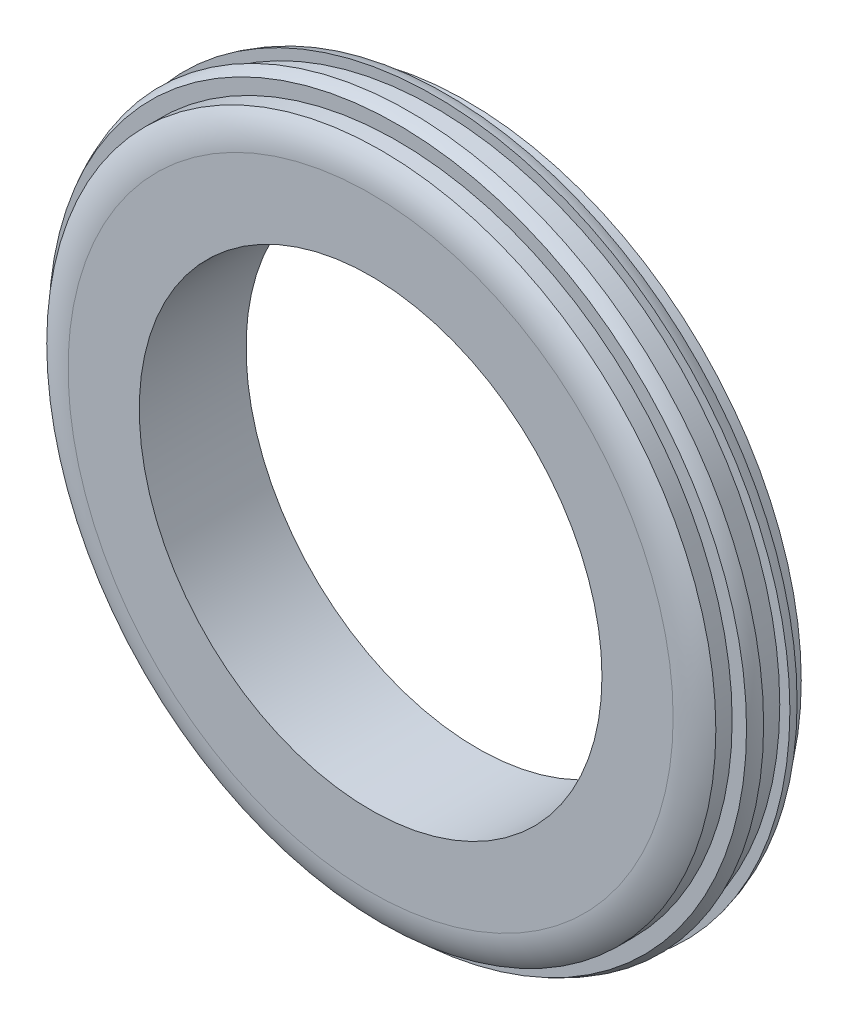
ISO-10303-21;
HEADER;
FILE_DESCRIPTION(('STEP AP214'),'2;1');
FILE_NAME('part.step','',(''),(''),'','','');
FILE_SCHEMA(('AUTOMOTIVE_DESIGN { 1 0 10303 214 1 1 1 1 }'));
ENDSEC;
DATA;
#1=APPLICATION_CONTEXT('core data for automotive mechanical design processes');
#2=APPLICATION_PROTOCOL_DEFINITION('international standard','automotive_design',2000,#1);
#3=PRODUCT_CONTEXT('',#1,'mechanical');
#4=PRODUCT('Part','Part','',(#3));
#5=PRODUCT_RELATED_PRODUCT_CATEGORY('part','',(#4));
#6=PRODUCT_DEFINITION_FORMATION('','',#4);
#7=PRODUCT_DEFINITION_CONTEXT('part definition',#1,'design');
#8=PRODUCT_DEFINITION('design','',#6,#7);
#9=PRODUCT_DEFINITION_SHAPE('','',#8);
#10=(LENGTH_UNIT() NAMED_UNIT(*) SI_UNIT(.MILLI.,.METRE.));
#11=(NAMED_UNIT(*) PLANE_ANGLE_UNIT() SI_UNIT($,.RADIAN.));
#12=(NAMED_UNIT(*) SI_UNIT($,.STERADIAN.) SOLID_ANGLE_UNIT());
#13=UNCERTAINTY_MEASURE_WITH_UNIT(LENGTH_MEASURE(1.E-05),#10,'distance_accuracy_value','');
#14=(GEOMETRIC_REPRESENTATION_CONTEXT(3) GLOBAL_UNCERTAINTY_ASSIGNED_CONTEXT((#13)) GLOBAL_UNIT_ASSIGNED_CONTEXT((#10,
#11,#12)) REPRESENTATION_CONTEXT('',''));
#15=CARTESIAN_POINT('',(0.,0.,0.));
#16=DIRECTION('',(0.,0.,1.));
#17=DIRECTION('',(1.,0.,0.));
#18=AXIS2_PLACEMENT_3D('',#15,#16,#17);
#19=CARTESIAN_POINT('',(0.,0.,3.90243902439026));
#20=DIRECTION('',(0.,0.,1.));
#21=DIRECTION('',(1.,0.,0.));
#22=AXIS2_PLACEMENT_3D('',#19,#20,#21);
#23=TOROIDAL_SURFACE('',#22,170.,30.);
#24=CARTESIAN_POINT('',(0.,0.,-26.0975609756097));
#25=DIRECTION('',(0.,0.,1.));
#26=DIRECTION('',(1.,0.,0.));
#27=AXIS2_PLACEMENT_3D('',#24,#25,#26);
#28=CIRCLE('',#27,170.);
#29=CARTESIAN_POINT('',(170.,0.,-26.0975609756097));
#30=VERTEX_POINT('',#29);
#31=EDGE_CURVE('E65',#30,#30,#28,.T.);
#32=ORIENTED_EDGE('',*,*,#31,.T.);
#33=EDGE_LOOP('',(#32));
#34=FACE_BOUND('',#33,.T.);
#35=CARTESIAN_POINT('',(0.,0.,-20.099283843259));
#36=DIRECTION('',(0.,0.,1.));
#37=DIRECTION('',(1.,0.,0.));
#38=AXIS2_PLACEMENT_3D('',#35,#36,#37);
#39=CIRCLE('',#38,187.997702614072);
#40=CARTESIAN_POINT('',(187.997702614072,0.,-20.099283843259));
#41=VERTEX_POINT('',#40);
#42=EDGE_CURVE('E60',#41,#41,#39,.T.);
#43=ORIENTED_EDGE('',*,*,#42,.F.);
#44=EDGE_LOOP('',(#43));
#45=FACE_BOUND('',#44,.T.);
#46=ADVANCED_FACE('F31',(#34,#45),#23,.T.);
#47=CARTESIAN_POINT('',(0.,0.,33.9024390243902));
#48=DIRECTION('',(0.,0.,1.));
#49=DIRECTION('',(1.,0.,0.));
#50=AXIS2_PLACEMENT_3D('',#47,#48,#49);
#51=CIRCLE('',#50,170.);
#52=CARTESIAN_POINT('',(170.,0.,33.9024390243902));
#53=VERTEX_POINT('',#52);
#54=EDGE_CURVE('E44',#53,#53,#51,.T.);
#55=ORIENTED_EDGE('',*,*,#54,.F.);
#56=EDGE_LOOP('',(#55));
#57=FACE_BOUND('',#56,.T.);
#58=CARTESIAN_POINT('',(0.,0.,27.9041618920396));
#59=DIRECTION('',(0.,0.,-1.));
#60=DIRECTION('',(-1.,0.,0.));
#61=AXIS2_PLACEMENT_3D('',#58,#59,#60);
#62=CIRCLE('',#61,187.997702614072);
#63=CARTESIAN_POINT('',(-187.997702614072,0.,27.9041618920396));
#64=VERTEX_POINT('',#63);
#65=EDGE_CURVE('E55',#64,#64,#62,.T.);
#66=ORIENTED_EDGE('',*,*,#65,.F.);
#67=EDGE_LOOP('',(#66));
#68=FACE_BOUND('',#67,.T.);
#69=ADVANCED_FACE('F102',(#57,#68),#23,.T.);
#70=CARTESIAN_POINT('',(0.,170.,-26.0975609756097));
#71=DIRECTION('',(0.,0.,1.));
#72=DIRECTION('',(1.,0.,0.));
#73=AXIS2_PLACEMENT_3D('',#70,#71,#72);
#74=PLANE('',#73);
#75=ORIENTED_EDGE('',*,*,#31,.F.);
#76=EDGE_LOOP('',(#75));
#77=FACE_BOUND('',#76,.T.);
#78=CARTESIAN_POINT('',(0.,0.,-26.0975609756097));
#79=DIRECTION('',(0.,0.,1.));
#80=DIRECTION('',(1.,0.,0.));
#81=AXIS2_PLACEMENT_3D('',#78,#79,#80);
#82=CIRCLE('',#81,130.);
#83=CARTESIAN_POINT('',(130.,0.,-26.0975609756097));
#84=VERTEX_POINT('',#83);
#85=EDGE_CURVE('E10',#84,#84,#82,.T.);
#86=ORIENTED_EDGE('',*,*,#85,.T.);
#87=EDGE_LOOP('',(#86));
#88=FACE_BOUND('',#87,.T.);
#89=ADVANCED_FACE('F33',(#77,#88),#74,.F.);
#90=CARTESIAN_POINT('',(0.,0.,102.578397212544));
#91=DIRECTION('',(0.,0.,1.));
#92=DIRECTION('',(1.,0.,0.));
#93=AXIS2_PLACEMENT_3D('',#90,#91,#92);
#94=CYLINDRICAL_SURFACE('',#93,130.);
#95=ORIENTED_EDGE('',*,*,#85,.F.);
#96=EDGE_LOOP('',(#95));
#97=FACE_BOUND('',#96,.T.);
#98=CARTESIAN_POINT('',(0.,0.,33.9024390243902));
#99=DIRECTION('',(0.,0.,1.));
#100=DIRECTION('',(1.,0.,0.));
#101=AXIS2_PLACEMENT_3D('',#98,#99,#100);
#102=CIRCLE('',#101,130.);
#103=CARTESIAN_POINT('',(130.,0.,33.9024390243902));
#104=VERTEX_POINT('',#103);
#105=EDGE_CURVE('E39',#104,#104,#102,.T.);
#106=ORIENTED_EDGE('',*,*,#105,.T.);
#107=EDGE_LOOP('',(#106));
#108=FACE_BOUND('',#107,.T.);
#109=ADVANCED_FACE('F208',(#97,#108),#94,.F.);
#110=CARTESIAN_POINT('',(0.,170.,33.9024390243902));
#111=DIRECTION('',(0.,0.,-1.));
#112=DIRECTION('',(-1.,0.,0.));
#113=AXIS2_PLACEMENT_3D('',#110,#111,#112);
#114=PLANE('',#113);
#115=ORIENTED_EDGE('',*,*,#105,.F.);
#116=EDGE_LOOP('',(#115));
#117=FACE_BOUND('',#116,.T.);
#118=ORIENTED_EDGE('',*,*,#54,.T.);
#119=EDGE_LOOP('',(#118));
#120=FACE_BOUND('',#119,.T.);
#121=ADVANCED_FACE('F92',(#117,#120),#114,.F.);
#122=CARTESIAN_POINT('',(0.,373.394128317447,18.7317993338107));
#123=DIRECTION('',(0.,0.,1.));
#124=DIRECTION('',(1.,0.,0.));
#125=AXIS2_PLACEMENT_3D('',#122,#123,#124);
#126=PLANE('',#125);
#127=CARTESIAN_POINT('',(0.,0.,18.7317993338107));
#128=DIRECTION('',(0.,0.,1.));
#129=DIRECTION('',(1.,0.,0.));
#130=AXIS2_PLACEMENT_3D('',#127,#128,#129);
#131=CIRCLE('',#130,187.997702614072);
#132=CARTESIAN_POINT('',(187.997702614072,0.,18.7317993338107));
#133=VERTEX_POINT('',#132);
#134=EDGE_CURVE('E79',#133,#133,#131,.T.);
#135=ORIENTED_EDGE('',*,*,#134,.F.);
#136=EDGE_LOOP('',(#135));
#137=FACE_BOUND('',#136,.T.);
#138=CARTESIAN_POINT('',(0.,0.,18.7317993338107));
#139=DIRECTION('',(0.,0.,1.));
#140=DIRECTION('',(1.,0.,0.));
#141=AXIS2_PLACEMENT_3D('',#138,#139,#140);
#142=CIRCLE('',#141,196.07853663098);
#143=CARTESIAN_POINT('',(196.07853663098,0.,18.7317993338107));
#144=VERTEX_POINT('',#143);
#145=EDGE_CURVE('E58',#144,#144,#142,.T.);
#146=ORIENTED_EDGE('',*,*,#145,.T.);
#147=EDGE_LOOP('',(#146));
#148=FACE_BOUND('',#147,.T.);
#149=ADVANCED_FACE('F89',(#137,#148),#126,.T.);
#150=CARTESIAN_POINT('',(0.,0.,101.363868033293));
#151=DIRECTION('',(0.,0.,1.));
#152=DIRECTION('',(1.,0.,0.));
#153=AXIS2_PLACEMENT_3D('',#150,#151,#152);
#154=CYLINDRICAL_SURFACE('',#153,187.997702614072);
#155=ORIENTED_EDGE('',*,*,#134,.T.);
#156=EDGE_LOOP('',(#155));
#157=FACE_BOUND('',#156,.T.);
#158=ORIENTED_EDGE('',*,*,#65,.T.);
#159=EDGE_LOOP('',(#158));
#160=FACE_BOUND('',#159,.T.);
#161=ADVANCED_FACE('F86',(#157,#160),#154,.T.);
#162=CARTESIAN_POINT('',(0.,410.322684656738,-8.39938491546377));
#163=DIRECTION('',(0.,0.,-1.));
#164=DIRECTION('',(-1.,0.,0.));
#165=AXIS2_PLACEMENT_3D('',#162,#163,#164);
#166=PLANE('',#165);
#167=CARTESIAN_POINT('',(0.,0.,-8.39938491546377));
#168=DIRECTION('',(0.,0.,1.));
#169=DIRECTION('',(1.,0.,0.));
#170=AXIS2_PLACEMENT_3D('',#167,#168,#169);
#171=CIRCLE('',#170,187.997702614072);
#172=CARTESIAN_POINT('',(187.997702614072,0.,-8.39938491546377));
#173=VERTEX_POINT('',#172);
#174=EDGE_CURVE('E80',#173,#173,#171,.T.);
#175=ORIENTED_EDGE('',*,*,#174,.T.);
#176=EDGE_LOOP('',(#175));
#177=FACE_BOUND('',#176,.T.);
#178=CARTESIAN_POINT('',(0.,0.,-8.39938491546377));
#179=DIRECTION('',(0.,0.,-1.));
#180=DIRECTION('',(-1.,0.,0.));
#181=AXIS2_PLACEMENT_3D('',#178,#179,#180);
#182=CIRCLE('',#181,197.361745700025);
#183=CARTESIAN_POINT('',(-197.361745700025,0.,-8.39938491546377));
#184=VERTEX_POINT('',#183);
#185=EDGE_CURVE('E35',#184,#184,#182,.T.);
#186=ORIENTED_EDGE('',*,*,#185,.T.);
#187=EDGE_LOOP('',(#186));
#188=FACE_BOUND('',#187,.T.);
#189=ADVANCED_FACE('F110',(#177,#188),#166,.T.);
#190=CARTESIAN_POINT('',(0.,0.,101.363868033293));
#191=DIRECTION('',(0.,0.,1.));
#192=DIRECTION('',(1.,0.,0.));
#193=AXIS2_PLACEMENT_3D('',#190,#191,#192);
#194=CYLINDRICAL_SURFACE('',#193,187.997702614072);
#195=ORIENTED_EDGE('',*,*,#174,.F.);
#196=EDGE_LOOP('',(#195));
#197=FACE_BOUND('',#196,.T.);
#198=ORIENTED_EDGE('',*,*,#42,.T.);
#199=EDGE_LOOP('',(#198));
#200=FACE_BOUND('',#199,.T.);
#201=ADVANCED_FACE('F99',(#197,#200),#194,.T.);
#202=CARTESIAN_POINT('',(0.,0.,11.9490032714921));
#203=DIRECTION('',(0.,0.,-1.));
#204=DIRECTION('',(-1.,0.,0.));
#205=AXIS2_PLACEMENT_3D('',#202,#203,#204);
#206=CIRCLE('',#205,198.900740540984);
#207=CARTESIAN_POINT('',(-198.900740540984,0.,11.9490032714921));
#208=VERTEX_POINT('',#207);
#209=EDGE_CURVE('E48',#208,#208,#206,.T.);
#210=ORIENTED_EDGE('',*,*,#209,.F.);
#211=EDGE_LOOP('',(#210));
#212=FACE_BOUND('',#211,.T.);
#213=ORIENTED_EDGE('',*,*,#145,.F.);
#214=EDGE_LOOP('',(#213));
#215=FACE_BOUND('',#214,.T.);
#216=ADVANCED_FACE('F96',(#212,#215),#23,.T.);
#217=CARTESIAN_POINT('',(0.,320.262225829285,-2.37023286006943));
#218=DIRECTION('',(0.,0.,1.));
#219=DIRECTION('',(1.,0.,0.));
#220=AXIS2_PLACEMENT_3D('',#217,#218,#219);
#221=PLANE('',#220);
#222=CARTESIAN_POINT('',(0.,0.,-2.37023286006943));
#223=DIRECTION('',(0.,0.,1.));
#224=DIRECTION('',(1.,0.,0.));
#225=AXIS2_PLACEMENT_3D('',#222,#223,#224);
#226=CIRCLE('',#225,193.650032666004);
#227=CARTESIAN_POINT('',(193.650032666004,0.,-2.37023286006943));
#228=VERTEX_POINT('',#227);
#229=EDGE_CURVE('E76',#228,#228,#226,.T.);
#230=ORIENTED_EDGE('',*,*,#229,.F.);
#231=EDGE_LOOP('',(#230));
#232=FACE_BOUND('',#231,.T.);
#233=CARTESIAN_POINT('',(0.,0.,-2.37023286006943));
#234=DIRECTION('',(0.,0.,1.));
#235=DIRECTION('',(1.,0.,0.));
#236=AXIS2_PLACEMENT_3D('',#233,#234,#235);
#237=CIRCLE('',#236,199.336898053985);
#238=CARTESIAN_POINT('',(199.336898053985,0.,-2.37023286006943));
#239=VERTEX_POINT('',#238);
#240=EDGE_CURVE('E51',#239,#239,#237,.T.);
#241=ORIENTED_EDGE('',*,*,#240,.T.);
#242=EDGE_LOOP('',(#241));
#243=FACE_BOUND('',#242,.T.);
#244=ADVANCED_FACE('F98',(#232,#243),#221,.T.);
#245=CARTESIAN_POINT('',(0.,320.262225829285,11.9490032714921));
#246=DIRECTION('',(0.,0.,-1.));
#247=DIRECTION('',(-1.,0.,0.));
#248=AXIS2_PLACEMENT_3D('',#245,#246,#247);
#249=PLANE('',#248);
#250=CARTESIAN_POINT('',(0.,0.,11.9490032714921));
#251=DIRECTION('',(0.,0.,1.));
#252=DIRECTION('',(1.,0.,0.));
#253=AXIS2_PLACEMENT_3D('',#250,#251,#252);
#254=CIRCLE('',#253,193.650032666004);
#255=CARTESIAN_POINT('',(193.650032666004,0.,11.9490032714921));
#256=VERTEX_POINT('',#255);
#257=EDGE_CURVE('E52',#256,#256,#254,.T.);
#258=ORIENTED_EDGE('',*,*,#257,.T.);
#259=EDGE_LOOP('',(#258));
#260=FACE_BOUND('',#259,.T.);
#261=ORIENTED_EDGE('',*,*,#209,.T.);
#262=EDGE_LOOP('',(#261));
#263=FACE_BOUND('',#262,.T.);
#264=ADVANCED_FACE('F107',(#260,#263),#249,.T.);
#265=CARTESIAN_POINT('',(0.,0.,101.363868033293));
#266=DIRECTION('',(0.,0.,1.));
#267=DIRECTION('',(1.,0.,0.));
#268=AXIS2_PLACEMENT_3D('',#265,#266,#267);
#269=CYLINDRICAL_SURFACE('',#268,193.650032666004);
#270=ORIENTED_EDGE('',*,*,#229,.T.);
#271=EDGE_LOOP('',(#270));
#272=FACE_BOUND('',#271,.T.);
#273=ORIENTED_EDGE('',*,*,#257,.F.);
#274=EDGE_LOOP('',(#273));
#275=FACE_BOUND('',#274,.T.);
#276=ADVANCED_FACE('F123',(#272,#275),#269,.T.);
#277=ORIENTED_EDGE('',*,*,#240,.F.);
#278=EDGE_LOOP('',(#277));
#279=FACE_BOUND('',#278,.T.);
#280=ORIENTED_EDGE('',*,*,#185,.F.);
#281=EDGE_LOOP('',(#280));
#282=FACE_BOUND('',#281,.T.);
#283=ADVANCED_FACE('F114',(#279,#282),#23,.T.);
#284=CLOSED_SHELL('',(#46,#69,#89,#109,#121,#149,#161,#189,#201,#216,#244,#264,#276,#283));
#285=MANIFOLD_SOLID_BREP('B2',#284);
#286=ADVANCED_BREP_SHAPE_REPRESENTATION('',(#18,#285),#14);
#287=SHAPE_DEFINITION_REPRESENTATION(#9,#286);
ENDSEC;
END-ISO-10303-21;
